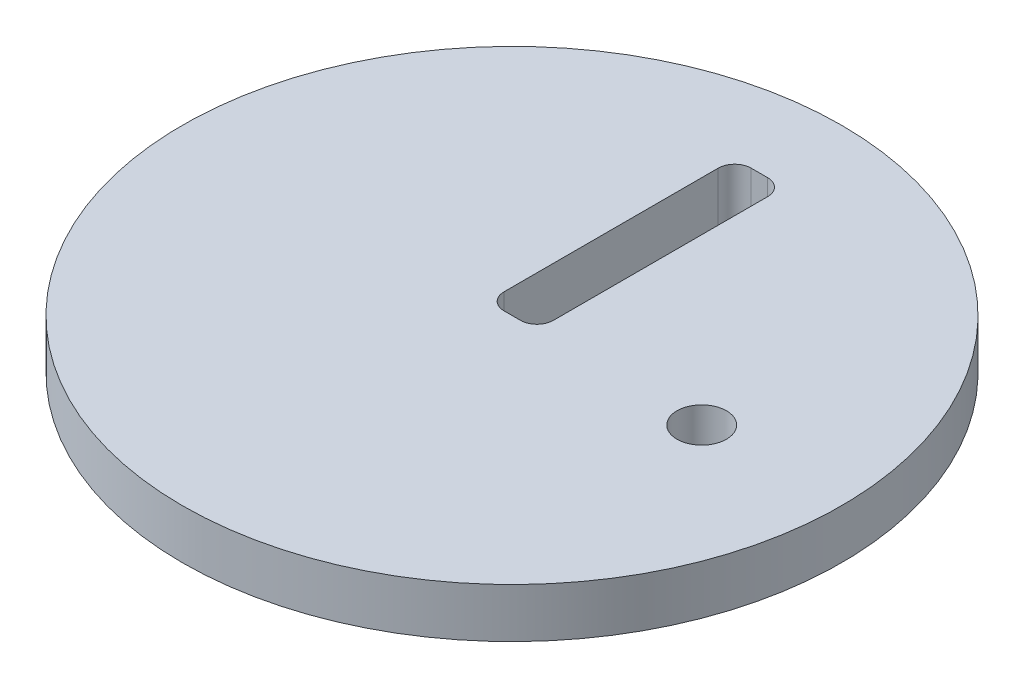
ISO-10303-21;
HEADER;
FILE_DESCRIPTION(('STEP AP214'),'2;1');
FILE_NAME('part.step','',(''),(''),'','','');
FILE_SCHEMA(('AUTOMOTIVE_DESIGN { 1 0 10303 214 1 1 1 1 }'));
ENDSEC;
DATA;
#1=APPLICATION_CONTEXT('core data for automotive mechanical design processes');
#2=APPLICATION_PROTOCOL_DEFINITION('international standard','automotive_design',2000,#1);
#3=PRODUCT_CONTEXT('',#1,'mechanical');
#4=PRODUCT('Part','Part','',(#3));
#5=PRODUCT_RELATED_PRODUCT_CATEGORY('part','',(#4));
#6=PRODUCT_DEFINITION_FORMATION('','',#4);
#7=PRODUCT_DEFINITION_CONTEXT('part definition',#1,'design');
#8=PRODUCT_DEFINITION('design','',#6,#7);
#9=PRODUCT_DEFINITION_SHAPE('','',#8);
#10=(LENGTH_UNIT() NAMED_UNIT(*) SI_UNIT(.MILLI.,.METRE.));
#11=(NAMED_UNIT(*) PLANE_ANGLE_UNIT() SI_UNIT($,.RADIAN.));
#12=(NAMED_UNIT(*) SI_UNIT($,.STERADIAN.) SOLID_ANGLE_UNIT());
#13=UNCERTAINTY_MEASURE_WITH_UNIT(LENGTH_MEASURE(1.E-05),#10,'distance_accuracy_value','');
#14=(GEOMETRIC_REPRESENTATION_CONTEXT(3) GLOBAL_UNCERTAINTY_ASSIGNED_CONTEXT((#13)) GLOBAL_UNIT_ASSIGNED_CONTEXT((#10,
#11,#12)) REPRESENTATION_CONTEXT('',''));
#15=CARTESIAN_POINT('',(0.,0.,0.));
#16=DIRECTION('',(0.,0.,1.));
#17=DIRECTION('',(1.,0.,0.));
#18=AXIS2_PLACEMENT_3D('',#15,#16,#17);
#19=CARTESIAN_POINT('',(0.,3.,0.));
#20=DIRECTION('',(0.,-1.,0.));
#21=DIRECTION('',(0.,0.,-1.));
#22=AXIS2_PLACEMENT_3D('',#19,#20,#21);
#23=CYLINDRICAL_SURFACE('',#22,20.);
#24=CARTESIAN_POINT('',(0.,3.,0.));
#25=DIRECTION('',(0.,1.,0.));
#26=DIRECTION('',(0.,0.,1.));
#27=AXIS2_PLACEMENT_3D('',#24,#25,#26);
#28=CIRCLE('',#27,20.);
#29=CARTESIAN_POINT('',(0.,3.,20.));
#30=VERTEX_POINT('',#29);
#31=EDGE_CURVE('E118',#30,#30,#28,.T.);
#32=ORIENTED_EDGE('',*,*,#31,.F.);
#33=EDGE_LOOP('',(#32));
#34=FACE_BOUND('',#33,.T.);
#35=CARTESIAN_POINT('',(0.,0.,0.));
#36=DIRECTION('',(0.,1.,0.));
#37=DIRECTION('',(0.,0.,1.));
#38=AXIS2_PLACEMENT_3D('',#35,#36,#37);
#39=CIRCLE('',#38,20.);
#40=CARTESIAN_POINT('',(0.,0.,20.));
#41=VERTEX_POINT('',#40);
#42=EDGE_CURVE('E134',#41,#41,#39,.T.);
#43=ORIENTED_EDGE('',*,*,#42,.T.);
#44=EDGE_LOOP('',(#43));
#45=FACE_BOUND('',#44,.T.);
#46=ADVANCED_FACE('F33',(#34,#45),#23,.T.);
#47=CARTESIAN_POINT('',(0.,3.,0.));
#48=DIRECTION('',(0.,1.,0.));
#49=DIRECTION('',(0.,0.,1.));
#50=AXIS2_PLACEMENT_3D('',#47,#48,#49);
#51=PLANE('',#50);
#52=CARTESIAN_POINT('',(11.5139121188383,3.,0.));
#53=DIRECTION('',(0.,1.,0.));
#54=DIRECTION('',(0.,0.,1.));
#55=AXIS2_PLACEMENT_3D('',#52,#53,#54);
#56=CIRCLE('',#55,1.5);
#57=CARTESIAN_POINT('',(11.5139121188383,3.,1.5));
#58=VERTEX_POINT('',#57);
#59=EDGE_CURVE('E171',#58,#58,#56,.T.);
#60=ORIENTED_EDGE('',*,*,#59,.F.);
#61=EDGE_LOOP('',(#60));
#62=FACE_BOUND('',#61,.T.);
#63=DIRECTION('',(0.,0.,-1.));
#64=VECTOR('',#63,1.);
#65=CARTESIAN_POINT('',(1.51391211883833,3.,-15.));
#66=LINE('',#65,#64);
#67=CARTESIAN_POINT('',(1.51391211883833,3.,-1.));
#68=VERTEX_POINT('',#67);
#69=CARTESIAN_POINT('',(1.51391211883833,3.,-14.));
#70=VERTEX_POINT('',#69);
#71=EDGE_CURVE('E128',#68,#70,#66,.T.);
#72=ORIENTED_EDGE('',*,*,#71,.F.);
#73=CARTESIAN_POINT('',(0.513912118838334,3.,-1.));
#74=DIRECTION('',(0.,1.,0.));
#75=DIRECTION('',(0.,0.,1.));
#76=AXIS2_PLACEMENT_3D('',#73,#74,#75);
#77=CIRCLE('',#76,1.);
#78=CARTESIAN_POINT('',(0.513912118838334,3.,0.));
#79=VERTEX_POINT('',#78);
#80=EDGE_CURVE('E41',#68,#79,#77,.F.);
#81=ORIENTED_EDGE('',*,*,#80,.T.);
#82=DIRECTION('',(1.,0.,0.));
#83=VECTOR('',#82,1.);
#84=CARTESIAN_POINT('',(-1.48608788116167,3.,0.));
#85=LINE('',#84,#83);
#86=CARTESIAN_POINT('',(-0.486087881161666,3.,0.));
#87=VERTEX_POINT('',#86);
#88=EDGE_CURVE('E123',#87,#79,#85,.T.);
#89=ORIENTED_EDGE('',*,*,#88,.F.);
#90=CARTESIAN_POINT('',(-0.486087881161666,3.,-1.));
#91=DIRECTION('',(0.,1.,0.));
#92=DIRECTION('',(0.,0.,1.));
#93=AXIS2_PLACEMENT_3D('',#90,#91,#92);
#94=CIRCLE('',#93,1.);
#95=CARTESIAN_POINT('',(-1.48608788116167,3.,-0.999999999999999));
#96=VERTEX_POINT('',#95);
#97=EDGE_CURVE('E122',#87,#96,#94,.F.);
#98=ORIENTED_EDGE('',*,*,#97,.T.);
#99=DIRECTION('',(0.,0.,1.));
#100=VECTOR('',#99,1.);
#101=CARTESIAN_POINT('',(-1.48608788116167,3.,-15.));
#102=LINE('',#101,#100);
#103=CARTESIAN_POINT('',(-1.48608788116167,3.,-14.));
#104=VERTEX_POINT('',#103);
#105=EDGE_CURVE('E114',#104,#96,#102,.T.);
#106=ORIENTED_EDGE('',*,*,#105,.F.);
#107=CARTESIAN_POINT('',(-0.486087881161667,3.,-14.));
#108=DIRECTION('',(0.,1.,0.));
#109=DIRECTION('',(0.,0.,1.));
#110=AXIS2_PLACEMENT_3D('',#107,#108,#109);
#111=CIRCLE('',#110,1.);
#112=CARTESIAN_POINT('',(-0.486087881161667,3.,-15.));
#113=VERTEX_POINT('',#112);
#114=EDGE_CURVE('E99',#104,#113,#111,.F.);
#115=ORIENTED_EDGE('',*,*,#114,.T.);
#116=DIRECTION('',(-1.,0.,0.));
#117=VECTOR('',#116,1.);
#118=CARTESIAN_POINT('',(-1.48608788116167,3.,-15.));
#119=LINE('',#118,#117);
#120=CARTESIAN_POINT('',(0.513912118838333,3.,-15.));
#121=VERTEX_POINT('',#120);
#122=EDGE_CURVE('E124',#121,#113,#119,.T.);
#123=ORIENTED_EDGE('',*,*,#122,.F.);
#124=CARTESIAN_POINT('',(0.513912118838333,3.,-14.));
#125=DIRECTION('',(0.,1.,0.));
#126=DIRECTION('',(0.,0.,1.));
#127=AXIS2_PLACEMENT_3D('',#124,#125,#126);
#128=CIRCLE('',#127,1.);
#129=EDGE_CURVE('E146',#121,#70,#128,.F.);
#130=ORIENTED_EDGE('',*,*,#129,.T.);
#131=EDGE_LOOP('',(#72,#81,#89,#98,#106,#115,#123,#130));
#132=FACE_BOUND('',#131,.T.);
#133=ORIENTED_EDGE('',*,*,#31,.T.);
#134=EDGE_LOOP('',(#133));
#135=FACE_BOUND('',#134,.T.);
#136=ADVANCED_FACE('F120',(#62,#132,#135),#51,.T.);
#137=CARTESIAN_POINT('',(0.,0.,0.));
#138=DIRECTION('',(0.,1.,0.));
#139=DIRECTION('',(0.,0.,1.));
#140=AXIS2_PLACEMENT_3D('',#137,#138,#139);
#141=PLANE('',#140);
#142=CARTESIAN_POINT('',(11.5139121188383,0.,0.));
#143=DIRECTION('',(0.,1.,0.));
#144=DIRECTION('',(0.,0.,1.));
#145=AXIS2_PLACEMENT_3D('',#142,#143,#144);
#146=CIRCLE('',#145,1.5);
#147=CARTESIAN_POINT('',(11.5139121188383,0.,1.5));
#148=VERTEX_POINT('',#147);
#149=EDGE_CURVE('E169',#148,#148,#146,.T.);
#150=ORIENTED_EDGE('',*,*,#149,.T.);
#151=EDGE_LOOP('',(#150));
#152=FACE_BOUND('',#151,.T.);
#153=DIRECTION('',(0.,0.,1.));
#154=VECTOR('',#153,1.);
#155=CARTESIAN_POINT('',(-1.48608788116167,0.,-15.));
#156=LINE('',#155,#154);
#157=CARTESIAN_POINT('',(-1.48608788116167,0.,-14.));
#158=VERTEX_POINT('',#157);
#159=CARTESIAN_POINT('',(-1.48608788116167,0.,-0.999999999999999));
#160=VERTEX_POINT('',#159);
#161=EDGE_CURVE('E117',#158,#160,#156,.T.);
#162=ORIENTED_EDGE('',*,*,#161,.T.);
#163=CARTESIAN_POINT('',(-0.486087881161666,0.,-1.));
#164=DIRECTION('',(0.,1.,0.));
#165=DIRECTION('',(0.,0.,1.));
#166=AXIS2_PLACEMENT_3D('',#163,#164,#165);
#167=CIRCLE('',#166,1.);
#168=CARTESIAN_POINT('',(-0.486087881161666,0.,0.));
#169=VERTEX_POINT('',#168);
#170=EDGE_CURVE('E157',#160,#169,#167,.T.);
#171=ORIENTED_EDGE('',*,*,#170,.T.);
#172=DIRECTION('',(1.,0.,0.));
#173=VECTOR('',#172,1.);
#174=CARTESIAN_POINT('',(-1.48608788116167,0.,0.));
#175=LINE('',#174,#173);
#176=CARTESIAN_POINT('',(0.513912118838334,0.,0.));
#177=VERTEX_POINT('',#176);
#178=EDGE_CURVE('E136',#169,#177,#175,.T.);
#179=ORIENTED_EDGE('',*,*,#178,.T.);
#180=CARTESIAN_POINT('',(0.513912118838334,0.,-1.));
#181=DIRECTION('',(0.,1.,0.));
#182=DIRECTION('',(0.,0.,1.));
#183=AXIS2_PLACEMENT_3D('',#180,#181,#182);
#184=CIRCLE('',#183,1.);
#185=CARTESIAN_POINT('',(1.51391211883833,0.,-1.));
#186=VERTEX_POINT('',#185);
#187=EDGE_CURVE('E11',#177,#186,#184,.T.);
#188=ORIENTED_EDGE('',*,*,#187,.T.);
#189=DIRECTION('',(0.,0.,-1.));
#190=VECTOR('',#189,1.);
#191=CARTESIAN_POINT('',(1.51391211883833,0.,-15.));
#192=LINE('',#191,#190);
#193=CARTESIAN_POINT('',(1.51391211883833,0.,-14.));
#194=VERTEX_POINT('',#193);
#195=EDGE_CURVE('E126',#186,#194,#192,.T.);
#196=ORIENTED_EDGE('',*,*,#195,.T.);
#197=CARTESIAN_POINT('',(0.513912118838333,0.,-14.));
#198=DIRECTION('',(0.,1.,0.));
#199=DIRECTION('',(0.,0.,1.));
#200=AXIS2_PLACEMENT_3D('',#197,#198,#199);
#201=CIRCLE('',#200,1.);
#202=CARTESIAN_POINT('',(0.513912118838333,0.,-15.));
#203=VERTEX_POINT('',#202);
#204=EDGE_CURVE('E149',#194,#203,#201,.T.);
#205=ORIENTED_EDGE('',*,*,#204,.T.);
#206=DIRECTION('',(-1.,0.,0.));
#207=VECTOR('',#206,1.);
#208=CARTESIAN_POINT('',(-1.48608788116167,0.,-15.));
#209=LINE('',#208,#207);
#210=CARTESIAN_POINT('',(-0.486087881161667,0.,-15.));
#211=VERTEX_POINT('',#210);
#212=EDGE_CURVE('E176',#203,#211,#209,.T.);
#213=ORIENTED_EDGE('',*,*,#212,.T.);
#214=CARTESIAN_POINT('',(-0.486087881161667,0.,-14.));
#215=DIRECTION('',(0.,1.,0.));
#216=DIRECTION('',(0.,0.,1.));
#217=AXIS2_PLACEMENT_3D('',#214,#215,#216);
#218=CIRCLE('',#217,1.);
#219=EDGE_CURVE('E108',#211,#158,#218,.T.);
#220=ORIENTED_EDGE('',*,*,#219,.T.);
#221=EDGE_LOOP('',(#162,#171,#179,#188,#196,#205,#213,#220));
#222=FACE_BOUND('',#221,.T.);
#223=ORIENTED_EDGE('',*,*,#42,.F.);
#224=EDGE_LOOP('',(#223));
#225=FACE_BOUND('',#224,.T.);
#226=ADVANCED_FACE('F185',(#152,#222,#225),#141,.F.);
#227=CARTESIAN_POINT('',(1.51391211883833,0.,-15.));
#228=DIRECTION('',(1.,0.,0.));
#229=DIRECTION('',(0.,0.,-1.));
#230=AXIS2_PLACEMENT_3D('',#227,#228,#229);
#231=PLANE('',#230);
#232=ORIENTED_EDGE('',*,*,#195,.F.);
#233=DIRECTION('',(0.,1.,0.));
#234=VECTOR('',#233,1.);
#235=CARTESIAN_POINT('',(1.51391211883833,3.,-1.));
#236=LINE('',#235,#234);
#237=EDGE_CURVE('E159',#186,#68,#236,.T.);
#238=ORIENTED_EDGE('',*,*,#237,.T.);
#239=ORIENTED_EDGE('',*,*,#71,.T.);
#240=DIRECTION('',(0.,1.,0.));
#241=VECTOR('',#240,1.);
#242=CARTESIAN_POINT('',(1.51391211883833,0.,-14.));
#243=LINE('',#242,#241);
#244=EDGE_CURVE('E143',#70,#194,#243,.F.);
#245=ORIENTED_EDGE('',*,*,#244,.T.);
#246=EDGE_LOOP('',(#232,#238,#239,#245));
#247=FACE_BOUND('',#246,.T.);
#248=ADVANCED_FACE('F165',(#247),#231,.F.);
#249=CARTESIAN_POINT('',(-1.48608788116167,0.,0.));
#250=DIRECTION('',(0.,0.,1.));
#251=DIRECTION('',(1.,0.,0.));
#252=AXIS2_PLACEMENT_3D('',#249,#250,#251);
#253=PLANE('',#252);
#254=ORIENTED_EDGE('',*,*,#88,.T.);
#255=DIRECTION('',(0.,1.,0.));
#256=VECTOR('',#255,1.);
#257=CARTESIAN_POINT('',(0.513912118838334,0.,0.));
#258=LINE('',#257,#256);
#259=EDGE_CURVE('E54',#79,#177,#258,.F.);
#260=ORIENTED_EDGE('',*,*,#259,.T.);
#261=ORIENTED_EDGE('',*,*,#178,.F.);
#262=DIRECTION('',(0.,1.,0.));
#263=VECTOR('',#262,1.);
#264=CARTESIAN_POINT('',(-0.486087881161666,3.,0.));
#265=LINE('',#264,#263);
#266=EDGE_CURVE('E151',#169,#87,#265,.T.);
#267=ORIENTED_EDGE('',*,*,#266,.T.);
#268=EDGE_LOOP('',(#254,#260,#261,#267));
#269=FACE_BOUND('',#268,.T.);
#270=ADVANCED_FACE('F213',(#269),#253,.F.);
#271=CARTESIAN_POINT('',(-1.48608788116167,0.,-15.));
#272=DIRECTION('',(-1.,0.,0.));
#273=DIRECTION('',(0.,0.,1.));
#274=AXIS2_PLACEMENT_3D('',#271,#272,#273);
#275=PLANE('',#274);
#276=ORIENTED_EDGE('',*,*,#105,.T.);
#277=DIRECTION('',(0.,1.,0.));
#278=VECTOR('',#277,1.);
#279=CARTESIAN_POINT('',(-1.48608788116167,0.,-1.));
#280=LINE('',#279,#278);
#281=EDGE_CURVE('E154',#96,#160,#280,.F.);
#282=ORIENTED_EDGE('',*,*,#281,.T.);
#283=ORIENTED_EDGE('',*,*,#161,.F.);
#284=DIRECTION('',(0.,1.,0.));
#285=VECTOR('',#284,1.);
#286=CARTESIAN_POINT('',(-1.48608788116167,3.,-14.));
#287=LINE('',#286,#285);
#288=EDGE_CURVE('E103',#158,#104,#287,.T.);
#289=ORIENTED_EDGE('',*,*,#288,.T.);
#290=EDGE_LOOP('',(#276,#282,#283,#289));
#291=FACE_BOUND('',#290,.T.);
#292=ADVANCED_FACE('F113',(#291),#275,.F.);
#293=CARTESIAN_POINT('',(-1.48608788116167,0.,-15.));
#294=DIRECTION('',(0.,0.,-1.));
#295=DIRECTION('',(-1.,0.,0.));
#296=AXIS2_PLACEMENT_3D('',#293,#294,#295);
#297=PLANE('',#296);
#298=ORIENTED_EDGE('',*,*,#212,.F.);
#299=DIRECTION('',(0.,1.,0.));
#300=VECTOR('',#299,1.);
#301=CARTESIAN_POINT('',(0.513912118838333,3.,-15.));
#302=LINE('',#301,#300);
#303=EDGE_CURVE('E140',#203,#121,#302,.T.);
#304=ORIENTED_EDGE('',*,*,#303,.T.);
#305=ORIENTED_EDGE('',*,*,#122,.T.);
#306=DIRECTION('',(0.,1.,0.));
#307=VECTOR('',#306,1.);
#308=CARTESIAN_POINT('',(-0.486087881161667,0.,-15.));
#309=LINE('',#308,#307);
#310=EDGE_CURVE('E105',#113,#211,#309,.F.);
#311=ORIENTED_EDGE('',*,*,#310,.T.);
#312=EDGE_LOOP('',(#298,#304,#305,#311));
#313=FACE_BOUND('',#312,.T.);
#314=ADVANCED_FACE('F218',(#313),#297,.F.);
#315=CARTESIAN_POINT('',(11.5139121188383,0.,0.));
#316=DIRECTION('',(0.,1.,0.));
#317=DIRECTION('',(0.,0.,1.));
#318=AXIS2_PLACEMENT_3D('',#315,#316,#317);
#319=CYLINDRICAL_SURFACE('',#318,1.5);
#320=ORIENTED_EDGE('',*,*,#149,.F.);
#321=EDGE_LOOP('',(#320));
#322=FACE_BOUND('',#321,.T.);
#323=ORIENTED_EDGE('',*,*,#59,.T.);
#324=EDGE_LOOP('',(#323));
#325=FACE_BOUND('',#324,.T.);
#326=ADVANCED_FACE('F182',(#322,#325),#319,.F.);
#327=CARTESIAN_POINT('',(-0.486087881161667,0.,-14.));
#328=DIRECTION('',(0.,-1.,0.));
#329=DIRECTION('',(0.,0.,-1.));
#330=AXIS2_PLACEMENT_3D('',#327,#328,#329);
#331=CYLINDRICAL_SURFACE('',#330,1.);
#332=ORIENTED_EDGE('',*,*,#219,.F.);
#333=ORIENTED_EDGE('',*,*,#310,.F.);
#334=ORIENTED_EDGE('',*,*,#114,.F.);
#335=ORIENTED_EDGE('',*,*,#288,.F.);
#336=EDGE_LOOP('',(#332,#333,#334,#335));
#337=FACE_BOUND('',#336,.T.);
#338=ADVANCED_FACE('F102',(#337),#331,.F.);
#339=CARTESIAN_POINT('',(0.513912118838333,0.,-14.));
#340=DIRECTION('',(0.,-1.,0.));
#341=DIRECTION('',(0.,0.,-1.));
#342=AXIS2_PLACEMENT_3D('',#339,#340,#341);
#343=CYLINDRICAL_SURFACE('',#342,1.);
#344=ORIENTED_EDGE('',*,*,#204,.F.);
#345=ORIENTED_EDGE('',*,*,#244,.F.);
#346=ORIENTED_EDGE('',*,*,#129,.F.);
#347=ORIENTED_EDGE('',*,*,#303,.F.);
#348=EDGE_LOOP('',(#344,#345,#346,#347));
#349=FACE_BOUND('',#348,.T.);
#350=ADVANCED_FACE('F201',(#349),#343,.F.);
#351=CARTESIAN_POINT('',(-0.486087881161666,0.,-1.));
#352=DIRECTION('',(0.,-1.,0.));
#353=DIRECTION('',(0.,0.,-1.));
#354=AXIS2_PLACEMENT_3D('',#351,#352,#353);
#355=CYLINDRICAL_SURFACE('',#354,1.);
#356=ORIENTED_EDGE('',*,*,#170,.F.);
#357=ORIENTED_EDGE('',*,*,#281,.F.);
#358=ORIENTED_EDGE('',*,*,#97,.F.);
#359=ORIENTED_EDGE('',*,*,#266,.F.);
#360=EDGE_LOOP('',(#356,#357,#358,#359));
#361=FACE_BOUND('',#360,.T.);
#362=ADVANCED_FACE('F203',(#361),#355,.F.);
#363=CARTESIAN_POINT('',(0.513912118838334,0.,-1.));
#364=DIRECTION('',(0.,-1.,0.));
#365=DIRECTION('',(0.,0.,-1.));
#366=AXIS2_PLACEMENT_3D('',#363,#364,#365);
#367=CYLINDRICAL_SURFACE('',#366,1.);
#368=ORIENTED_EDGE('',*,*,#187,.F.);
#369=ORIENTED_EDGE('',*,*,#259,.F.);
#370=ORIENTED_EDGE('',*,*,#80,.F.);
#371=ORIENTED_EDGE('',*,*,#237,.F.);
#372=EDGE_LOOP('',(#368,#369,#370,#371));
#373=FACE_BOUND('',#372,.T.);
#374=ADVANCED_FACE('F35',(#373),#367,.F.);
#375=CLOSED_SHELL('',(#46,#136,#226,#248,#270,#292,#314,#326,#338,#350,#362,#374));
#376=MANIFOLD_SOLID_BREP('B2',#375);
#377=ADVANCED_BREP_SHAPE_REPRESENTATION('',(#18,#376),#14);
#378=SHAPE_DEFINITION_REPRESENTATION(#9,#377);
ENDSEC;
END-ISO-10303-21;
